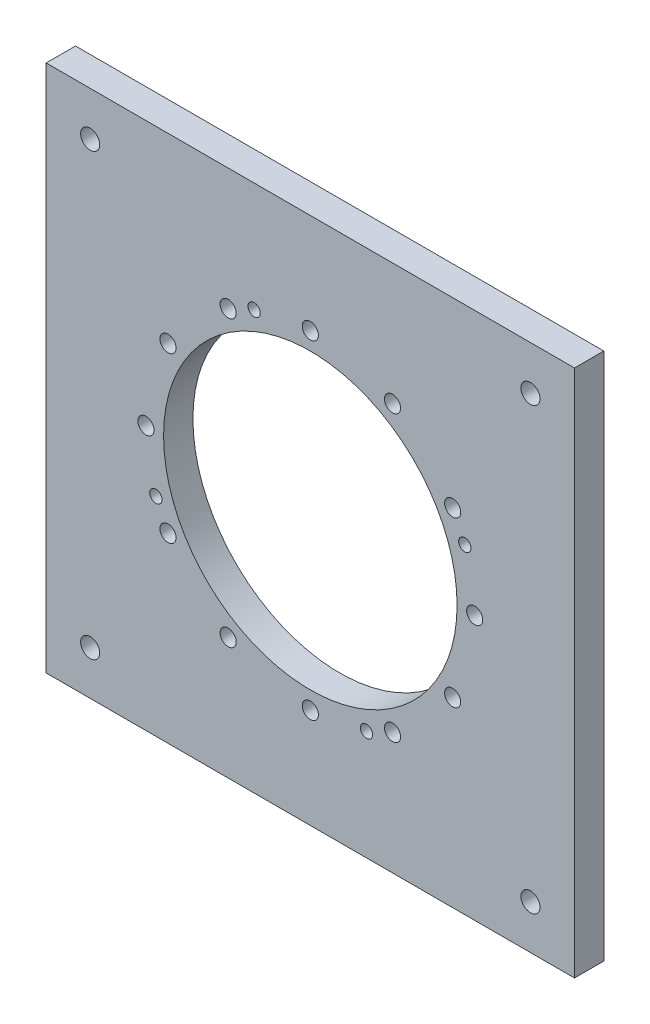
ISO-10303-21;
HEADER;
FILE_DESCRIPTION(('STEP AP214'),'2;1');
FILE_NAME('part.step','',(''),(''),'','','');
FILE_SCHEMA(('AUTOMOTIVE_DESIGN { 1 0 10303 214 1 1 1 1 }'));
ENDSEC;
DATA;
#1=APPLICATION_CONTEXT('core data for automotive mechanical design processes');
#2=APPLICATION_PROTOCOL_DEFINITION('international standard','automotive_design',2000,#1);
#3=PRODUCT_CONTEXT('',#1,'mechanical');
#4=PRODUCT('Part','Part','',(#3));
#5=PRODUCT_RELATED_PRODUCT_CATEGORY('part','',(#4));
#6=PRODUCT_DEFINITION_FORMATION('','',#4);
#7=PRODUCT_DEFINITION_CONTEXT('part definition',#1,'design');
#8=PRODUCT_DEFINITION('design','',#6,#7);
#9=PRODUCT_DEFINITION_SHAPE('','',#8);
#10=(LENGTH_UNIT() NAMED_UNIT(*) SI_UNIT(.MILLI.,.METRE.));
#11=(NAMED_UNIT(*) PLANE_ANGLE_UNIT() SI_UNIT($,.RADIAN.));
#12=(NAMED_UNIT(*) SI_UNIT($,.STERADIAN.) SOLID_ANGLE_UNIT());
#13=UNCERTAINTY_MEASURE_WITH_UNIT(LENGTH_MEASURE(1.E-05),#10,'distance_accuracy_value','');
#14=(GEOMETRIC_REPRESENTATION_CONTEXT(3) GLOBAL_UNCERTAINTY_ASSIGNED_CONTEXT((#13)) GLOBAL_UNIT_ASSIGNED_CONTEXT((#10,
#11,#12)) REPRESENTATION_CONTEXT('',''));
#15=CARTESIAN_POINT('',(0.,0.,0.));
#16=DIRECTION('',(0.,0.,1.));
#17=DIRECTION('',(1.,0.,0.));
#18=AXIS2_PLACEMENT_3D('',#15,#16,#17);
#19=CARTESIAN_POINT('',(-90.,90.,10.));
#20=DIRECTION('',(1.,0.,0.));
#21=DIRECTION('',(0.,0.,-1.));
#22=AXIS2_PLACEMENT_3D('',#19,#20,#21);
#23=PLANE('',#22);
#24=DIRECTION('',(0.,-1.,0.));
#25=VECTOR('',#24,1.);
#26=CARTESIAN_POINT('',(-90.,90.,0.));
#27=LINE('',#26,#25);
#28=CARTESIAN_POINT('',(-90.,90.,0.));
#29=VERTEX_POINT('',#28);
#30=CARTESIAN_POINT('',(-90.,-90.,0.));
#31=VERTEX_POINT('',#30);
#32=EDGE_CURVE('E115',#29,#31,#27,.T.);
#33=ORIENTED_EDGE('',*,*,#32,.T.);
#34=DIRECTION('',(0.,0.,-1.));
#35=VECTOR('',#34,1.);
#36=CARTESIAN_POINT('',(-90.,-90.,10.));
#37=LINE('',#36,#35);
#38=CARTESIAN_POINT('',(-90.,-90.,10.));
#39=VERTEX_POINT('',#38);
#40=EDGE_CURVE('E11',#39,#31,#37,.T.);
#41=ORIENTED_EDGE('',*,*,#40,.F.);
#42=DIRECTION('',(0.,-1.,0.));
#43=VECTOR('',#42,1.);
#44=CARTESIAN_POINT('',(-90.,90.,10.));
#45=LINE('',#44,#43);
#46=CARTESIAN_POINT('',(-90.,90.,10.));
#47=VERTEX_POINT('',#46);
#48=EDGE_CURVE('E99',#47,#39,#45,.T.);
#49=ORIENTED_EDGE('',*,*,#48,.F.);
#50=DIRECTION('',(0.,0.,-1.));
#51=VECTOR('',#50,1.);
#52=CARTESIAN_POINT('',(-90.,90.,10.));
#53=LINE('',#52,#51);
#54=EDGE_CURVE('E111',#47,#29,#53,.T.);
#55=ORIENTED_EDGE('',*,*,#54,.T.);
#56=EDGE_LOOP('',(#33,#41,#49,#55));
#57=FACE_BOUND('',#56,.T.);
#58=ADVANCED_FACE('F47',(#57),#23,.F.);
#59=CARTESIAN_POINT('',(-90.,-90.,10.));
#60=DIRECTION('',(0.,1.,0.));
#61=DIRECTION('',(0.,0.,1.));
#62=AXIS2_PLACEMENT_3D('',#59,#60,#61);
#63=PLANE('',#62);
#64=DIRECTION('',(1.,0.,0.));
#65=VECTOR('',#64,1.);
#66=CARTESIAN_POINT('',(-90.,-90.,0.));
#67=LINE('',#66,#65);
#68=CARTESIAN_POINT('',(90.,-90.,0.));
#69=VERTEX_POINT('',#68);
#70=EDGE_CURVE('E104',#31,#69,#67,.T.);
#71=ORIENTED_EDGE('',*,*,#70,.T.);
#72=DIRECTION('',(0.,0.,-1.));
#73=VECTOR('',#72,1.);
#74=CARTESIAN_POINT('',(90.,-90.,10.));
#75=LINE('',#74,#73);
#76=CARTESIAN_POINT('',(90.,-90.,10.));
#77=VERTEX_POINT('',#76);
#78=EDGE_CURVE('E56',#77,#69,#75,.T.);
#79=ORIENTED_EDGE('',*,*,#78,.F.);
#80=DIRECTION('',(1.,0.,0.));
#81=VECTOR('',#80,1.);
#82=CARTESIAN_POINT('',(-90.,-90.,10.));
#83=LINE('',#82,#81);
#84=EDGE_CURVE('E94',#39,#77,#83,.T.);
#85=ORIENTED_EDGE('',*,*,#84,.F.);
#86=ORIENTED_EDGE('',*,*,#40,.T.);
#87=EDGE_LOOP('',(#71,#79,#85,#86));
#88=FACE_BOUND('',#87,.T.);
#89=ADVANCED_FACE('F103',(#88),#63,.F.);
#90=CARTESIAN_POINT('',(90.,-90.,10.));
#91=DIRECTION('',(-1.,0.,0.));
#92=DIRECTION('',(0.,0.,1.));
#93=AXIS2_PLACEMENT_3D('',#90,#91,#92);
#94=PLANE('',#93);
#95=DIRECTION('',(0.,1.,0.));
#96=VECTOR('',#95,1.);
#97=CARTESIAN_POINT('',(90.,-90.,0.));
#98=LINE('',#97,#96);
#99=CARTESIAN_POINT('',(90.,90.,0.));
#100=VERTEX_POINT('',#99);
#101=EDGE_CURVE('E81',#69,#100,#98,.T.);
#102=ORIENTED_EDGE('',*,*,#101,.T.);
#103=DIRECTION('',(0.,0.,-1.));
#104=VECTOR('',#103,1.);
#105=CARTESIAN_POINT('',(90.,90.,10.));
#106=LINE('',#105,#104);
#107=CARTESIAN_POINT('',(90.,90.,10.));
#108=VERTEX_POINT('',#107);
#109=EDGE_CURVE('E106',#108,#100,#106,.T.);
#110=ORIENTED_EDGE('',*,*,#109,.F.);
#111=DIRECTION('',(0.,1.,0.));
#112=VECTOR('',#111,1.);
#113=CARTESIAN_POINT('',(90.,-90.,10.));
#114=LINE('',#113,#112);
#115=EDGE_CURVE('E97',#77,#108,#114,.T.);
#116=ORIENTED_EDGE('',*,*,#115,.F.);
#117=ORIENTED_EDGE('',*,*,#78,.T.);
#118=EDGE_LOOP('',(#102,#110,#116,#117));
#119=FACE_BOUND('',#118,.T.);
#120=ADVANCED_FACE('F107',(#119),#94,.F.);
#121=CARTESIAN_POINT('',(90.,90.,10.));
#122=DIRECTION('',(0.,-1.,0.));
#123=DIRECTION('',(0.,0.,-1.));
#124=AXIS2_PLACEMENT_3D('',#121,#122,#123);
#125=PLANE('',#124);
#126=DIRECTION('',(-1.,0.,0.));
#127=VECTOR('',#126,1.);
#128=CARTESIAN_POINT('',(90.,90.,0.));
#129=LINE('',#128,#127);
#130=EDGE_CURVE('E87',#100,#29,#129,.T.);
#131=ORIENTED_EDGE('',*,*,#130,.T.);
#132=ORIENTED_EDGE('',*,*,#54,.F.);
#133=DIRECTION('',(-1.,0.,0.));
#134=VECTOR('',#133,1.);
#135=CARTESIAN_POINT('',(90.,90.,10.));
#136=LINE('',#135,#134);
#137=EDGE_CURVE('E64',#108,#47,#136,.T.);
#138=ORIENTED_EDGE('',*,*,#137,.F.);
#139=ORIENTED_EDGE('',*,*,#109,.T.);
#140=EDGE_LOOP('',(#131,#132,#138,#139));
#141=FACE_BOUND('',#140,.T.);
#142=ADVANCED_FACE('F129',(#141),#125,.F.);
#143=CARTESIAN_POINT('',(0.,0.,10.));
#144=DIRECTION('',(0.,0.,1.));
#145=DIRECTION('',(1.,0.,0.));
#146=AXIS2_PLACEMENT_3D('',#143,#144,#145);
#147=PLANE('',#146);
#148=CARTESIAN_POINT('',(-28.,-48.4974226119286,10.));
#149=DIRECTION('',(0.,0.,1.));
#150=DIRECTION('',(1.,0.,0.));
#151=AXIS2_PLACEMENT_3D('',#148,#149,#150);
#152=CIRCLE('',#151,2.75);
#153=CARTESIAN_POINT('',(-25.25,-48.4974226119286,10.));
#154=VERTEX_POINT('',#153);
#155=EDGE_CURVE('E119',#154,#154,#152,.T.);
#156=ORIENTED_EDGE('',*,*,#155,.F.);
#157=EDGE_LOOP('',(#156));
#158=FACE_BOUND('',#157,.T.);
#159=CARTESIAN_POINT('',(0.,-56.,10.));
#160=DIRECTION('',(0.,0.,1.));
#161=DIRECTION('',(1.,0.,0.));
#162=AXIS2_PLACEMENT_3D('',#159,#160,#161);
#163=CIRCLE('',#162,2.75);
#164=CARTESIAN_POINT('',(2.74999999999999,-56.,10.));
#165=VERTEX_POINT('',#164);
#166=EDGE_CURVE('E139',#165,#165,#163,.T.);
#167=ORIENTED_EDGE('',*,*,#166,.F.);
#168=EDGE_LOOP('',(#167));
#169=FACE_BOUND('',#168,.T.);
#170=CARTESIAN_POINT('',(28.,-48.4974226119286,10.));
#171=DIRECTION('',(0.,0.,1.));
#172=DIRECTION('',(1.,0.,0.));
#173=AXIS2_PLACEMENT_3D('',#170,#171,#172);
#174=CIRCLE('',#173,2.75);
#175=CARTESIAN_POINT('',(30.75,-48.4974226119286,10.));
#176=VERTEX_POINT('',#175);
#177=EDGE_CURVE('E143',#176,#176,#174,.T.);
#178=ORIENTED_EDGE('',*,*,#177,.F.);
#179=EDGE_LOOP('',(#178));
#180=FACE_BOUND('',#179,.T.);
#181=CARTESIAN_POINT('',(48.4974226119285,-28.,10.));
#182=DIRECTION('',(0.,0.,1.));
#183=DIRECTION('',(1.,0.,0.));
#184=AXIS2_PLACEMENT_3D('',#181,#182,#183);
#185=CIRCLE('',#184,2.75);
#186=CARTESIAN_POINT('',(51.2474226119285,-28.,10.));
#187=VERTEX_POINT('',#186);
#188=EDGE_CURVE('E147',#187,#187,#185,.T.);
#189=ORIENTED_EDGE('',*,*,#188,.F.);
#190=EDGE_LOOP('',(#189));
#191=FACE_BOUND('',#190,.T.);
#192=CARTESIAN_POINT('',(52.6227867640109,19.1531280262374,10.));
#193=DIRECTION('',(0.,0.,1.));
#194=DIRECTION('',(1.,0.,0.));
#195=AXIS2_PLACEMENT_3D('',#192,#193,#194);
#196=CIRCLE('',#195,2.1);
#197=CARTESIAN_POINT('',(54.7227867640109,19.1531280262374,10.));
#198=VERTEX_POINT('',#197);
#199=EDGE_CURVE('E151',#198,#198,#196,.T.);
#200=ORIENTED_EDGE('',*,*,#199,.F.);
#201=EDGE_LOOP('',(#200));
#202=FACE_BOUND('',#201,.T.);
#203=CARTESIAN_POINT('',(-19.1531280262374,52.6227867640109,10.));
#204=DIRECTION('',(0.,0.,1.));
#205=DIRECTION('',(1.,0.,0.));
#206=AXIS2_PLACEMENT_3D('',#203,#204,#205);
#207=CIRCLE('',#206,2.1);
#208=CARTESIAN_POINT('',(-17.0531280262374,52.6227867640109,10.));
#209=VERTEX_POINT('',#208);
#210=EDGE_CURVE('E155',#209,#209,#207,.T.);
#211=ORIENTED_EDGE('',*,*,#210,.F.);
#212=EDGE_LOOP('',(#211));
#213=FACE_BOUND('',#212,.T.);
#214=CARTESIAN_POINT('',(-52.6227867640109,-19.1531280262374,10.));
#215=DIRECTION('',(0.,0.,1.));
#216=DIRECTION('',(1.,0.,0.));
#217=AXIS2_PLACEMENT_3D('',#214,#215,#216);
#218=CIRCLE('',#217,2.1);
#219=CARTESIAN_POINT('',(-50.5227867640109,-19.1531280262374,10.));
#220=VERTEX_POINT('',#219);
#221=EDGE_CURVE('E159',#220,#220,#218,.T.);
#222=ORIENTED_EDGE('',*,*,#221,.F.);
#223=EDGE_LOOP('',(#222));
#224=FACE_BOUND('',#223,.T.);
#225=CARTESIAN_POINT('',(19.1531280262375,-52.6227867640109,10.));
#226=DIRECTION('',(0.,0.,1.));
#227=DIRECTION('',(1.,0.,0.));
#228=AXIS2_PLACEMENT_3D('',#225,#226,#227);
#229=CIRCLE('',#228,2.1);
#230=CARTESIAN_POINT('',(21.2531280262375,-52.6227867640109,10.));
#231=VERTEX_POINT('',#230);
#232=EDGE_CURVE('E163',#231,#231,#229,.T.);
#233=ORIENTED_EDGE('',*,*,#232,.F.);
#234=EDGE_LOOP('',(#233));
#235=FACE_BOUND('',#234,.T.);
#236=CARTESIAN_POINT('',(-48.4974226119286,-28.,10.));
#237=DIRECTION('',(0.,0.,1.));
#238=DIRECTION('',(1.,0.,0.));
#239=AXIS2_PLACEMENT_3D('',#236,#237,#238);
#240=CIRCLE('',#239,2.75);
#241=CARTESIAN_POINT('',(-45.7474226119286,-28.,10.));
#242=VERTEX_POINT('',#241);
#243=EDGE_CURVE('E167',#242,#242,#240,.T.);
#244=ORIENTED_EDGE('',*,*,#243,.F.);
#245=EDGE_LOOP('',(#244));
#246=FACE_BOUND('',#245,.T.);
#247=CARTESIAN_POINT('',(-56.,0.,10.));
#248=DIRECTION('',(0.,0.,1.));
#249=DIRECTION('',(1.,0.,0.));
#250=AXIS2_PLACEMENT_3D('',#247,#248,#249);
#251=CIRCLE('',#250,2.75);
#252=CARTESIAN_POINT('',(-53.25,0.,10.));
#253=VERTEX_POINT('',#252);
#254=EDGE_CURVE('E171',#253,#253,#251,.T.);
#255=ORIENTED_EDGE('',*,*,#254,.F.);
#256=EDGE_LOOP('',(#255));
#257=FACE_BOUND('',#256,.T.);
#258=CARTESIAN_POINT('',(-48.4974226119286,28.,10.));
#259=DIRECTION('',(0.,0.,1.));
#260=DIRECTION('',(1.,0.,0.));
#261=AXIS2_PLACEMENT_3D('',#258,#259,#260);
#262=CIRCLE('',#261,2.75);
#263=CARTESIAN_POINT('',(-45.7474226119286,28.,10.));
#264=VERTEX_POINT('',#263);
#265=EDGE_CURVE('E175',#264,#264,#262,.T.);
#266=ORIENTED_EDGE('',*,*,#265,.F.);
#267=EDGE_LOOP('',(#266));
#268=FACE_BOUND('',#267,.T.);
#269=CARTESIAN_POINT('',(-28.,48.4974226119286,10.));
#270=DIRECTION('',(0.,0.,1.));
#271=DIRECTION('',(1.,0.,0.));
#272=AXIS2_PLACEMENT_3D('',#269,#270,#271);
#273=CIRCLE('',#272,2.75);
#274=CARTESIAN_POINT('',(-25.25,48.4974226119286,10.));
#275=VERTEX_POINT('',#274);
#276=EDGE_CURVE('E179',#275,#275,#273,.T.);
#277=ORIENTED_EDGE('',*,*,#276,.F.);
#278=EDGE_LOOP('',(#277));
#279=FACE_BOUND('',#278,.T.);
#280=CARTESIAN_POINT('',(0.,56.,10.));
#281=DIRECTION('',(0.,0.,1.));
#282=DIRECTION('',(1.,0.,0.));
#283=AXIS2_PLACEMENT_3D('',#280,#281,#282);
#284=CIRCLE('',#283,2.75);
#285=CARTESIAN_POINT('',(2.75,56.,10.));
#286=VERTEX_POINT('',#285);
#287=EDGE_CURVE('E183',#286,#286,#284,.T.);
#288=ORIENTED_EDGE('',*,*,#287,.F.);
#289=EDGE_LOOP('',(#288));
#290=FACE_BOUND('',#289,.T.);
#291=CARTESIAN_POINT('',(28.,48.4974226119286,10.));
#292=DIRECTION('',(0.,0.,1.));
#293=DIRECTION('',(1.,0.,0.));
#294=AXIS2_PLACEMENT_3D('',#291,#292,#293);
#295=CIRCLE('',#294,2.75);
#296=CARTESIAN_POINT('',(30.75,48.4974226119286,10.));
#297=VERTEX_POINT('',#296);
#298=EDGE_CURVE('E187',#297,#297,#295,.T.);
#299=ORIENTED_EDGE('',*,*,#298,.F.);
#300=EDGE_LOOP('',(#299));
#301=FACE_BOUND('',#300,.T.);
#302=CARTESIAN_POINT('',(48.4974226119286,28.,10.));
#303=DIRECTION('',(0.,0.,1.));
#304=DIRECTION('',(1.,0.,0.));
#305=AXIS2_PLACEMENT_3D('',#302,#303,#304);
#306=CIRCLE('',#305,2.75);
#307=CARTESIAN_POINT('',(51.2474226119286,28.,10.));
#308=VERTEX_POINT('',#307);
#309=EDGE_CURVE('E191',#308,#308,#306,.T.);
#310=ORIENTED_EDGE('',*,*,#309,.F.);
#311=EDGE_LOOP('',(#310));
#312=FACE_BOUND('',#311,.T.);
#313=CARTESIAN_POINT('',(56.,0.,10.));
#314=DIRECTION('',(0.,0.,1.));
#315=DIRECTION('',(1.,0.,0.));
#316=AXIS2_PLACEMENT_3D('',#313,#314,#315);
#317=CIRCLE('',#316,2.75);
#318=CARTESIAN_POINT('',(58.75,0.,10.));
#319=VERTEX_POINT('',#318);
#320=EDGE_CURVE('E195',#319,#319,#317,.T.);
#321=ORIENTED_EDGE('',*,*,#320,.F.);
#322=EDGE_LOOP('',(#321));
#323=FACE_BOUND('',#322,.T.);
#324=CARTESIAN_POINT('',(-75.,-75.,10.));
#325=DIRECTION('',(0.,0.,1.));
#326=DIRECTION('',(1.,0.,0.));
#327=AXIS2_PLACEMENT_3D('',#324,#325,#326);
#328=CIRCLE('',#327,3.25);
#329=CARTESIAN_POINT('',(-71.75,-75.,10.));
#330=VERTEX_POINT('',#329);
#331=EDGE_CURVE('E199',#330,#330,#328,.T.);
#332=ORIENTED_EDGE('',*,*,#331,.F.);
#333=EDGE_LOOP('',(#332));
#334=FACE_BOUND('',#333,.T.);
#335=CARTESIAN_POINT('',(-75.,75.,10.));
#336=DIRECTION('',(0.,0.,1.));
#337=DIRECTION('',(1.,0.,0.));
#338=AXIS2_PLACEMENT_3D('',#335,#336,#337);
#339=CIRCLE('',#338,3.25);
#340=CARTESIAN_POINT('',(-71.75,75.,10.));
#341=VERTEX_POINT('',#340);
#342=EDGE_CURVE('E203',#341,#341,#339,.T.);
#343=ORIENTED_EDGE('',*,*,#342,.F.);
#344=EDGE_LOOP('',(#343));
#345=FACE_BOUND('',#344,.T.);
#346=CARTESIAN_POINT('',(75.,-75.,10.));
#347=DIRECTION('',(0.,0.,1.));
#348=DIRECTION('',(1.,0.,0.));
#349=AXIS2_PLACEMENT_3D('',#346,#347,#348);
#350=CIRCLE('',#349,3.25);
#351=CARTESIAN_POINT('',(78.25,-75.,10.));
#352=VERTEX_POINT('',#351);
#353=EDGE_CURVE('E207',#352,#352,#350,.T.);
#354=ORIENTED_EDGE('',*,*,#353,.F.);
#355=EDGE_LOOP('',(#354));
#356=FACE_BOUND('',#355,.T.);
#357=CARTESIAN_POINT('',(75.,75.,10.));
#358=DIRECTION('',(0.,0.,1.));
#359=DIRECTION('',(1.,0.,0.));
#360=AXIS2_PLACEMENT_3D('',#357,#358,#359);
#361=CIRCLE('',#360,3.25);
#362=CARTESIAN_POINT('',(78.25,75.,10.));
#363=VERTEX_POINT('',#362);
#364=EDGE_CURVE('E211',#363,#363,#361,.T.);
#365=ORIENTED_EDGE('',*,*,#364,.F.);
#366=EDGE_LOOP('',(#365));
#367=FACE_BOUND('',#366,.T.);
#368=CARTESIAN_POINT('',(0.,0.,10.));
#369=DIRECTION('',(0.,0.,1.));
#370=DIRECTION('',(1.,0.,0.));
#371=AXIS2_PLACEMENT_3D('',#368,#369,#370);
#372=CIRCLE('',#371,50.);
#373=CARTESIAN_POINT('',(50.,0.,10.));
#374=VERTEX_POINT('',#373);
#375=EDGE_CURVE('E215',#374,#374,#372,.T.);
#376=ORIENTED_EDGE('',*,*,#375,.F.);
#377=EDGE_LOOP('',(#376));
#378=FACE_BOUND('',#377,.T.);
#379=ORIENTED_EDGE('',*,*,#48,.T.);
#380=ORIENTED_EDGE('',*,*,#84,.T.);
#381=ORIENTED_EDGE('',*,*,#115,.T.);
#382=ORIENTED_EDGE('',*,*,#137,.T.);
#383=EDGE_LOOP('',(#379,#380,#381,#382));
#384=FACE_BOUND('',#383,.T.);
#385=ADVANCED_FACE('F95',(#158,#169,#180,#191,#202,#213,#224,#235,#246,#257,#268,#279,#290,#301,
#312,#323,#334,#345,#356,#367,#378,#384),#147,.T.);
#386=CARTESIAN_POINT('',(0.,0.,0.));
#387=DIRECTION('',(0.,0.,1.));
#388=DIRECTION('',(1.,0.,0.));
#389=AXIS2_PLACEMENT_3D('',#386,#387,#388);
#390=PLANE('',#389);
#391=CARTESIAN_POINT('',(-28.,-48.4974226119286,0.));
#392=DIRECTION('',(0.,0.,-1.));
#393=DIRECTION('',(-1.,0.,0.));
#394=AXIS2_PLACEMENT_3D('',#391,#392,#393);
#395=CIRCLE('',#394,2.75);
#396=CARTESIAN_POINT('',(-30.75,-48.4974226119286,0.));
#397=VERTEX_POINT('',#396);
#398=EDGE_CURVE('E229',#397,#397,#395,.T.);
#399=ORIENTED_EDGE('',*,*,#398,.F.);
#400=EDGE_LOOP('',(#399));
#401=FACE_BOUND('',#400,.T.);
#402=CARTESIAN_POINT('',(0.,-56.,0.));
#403=DIRECTION('',(0.,0.,-1.));
#404=DIRECTION('',(-1.,0.,0.));
#405=AXIS2_PLACEMENT_3D('',#402,#403,#404);
#406=CIRCLE('',#405,2.75);
#407=CARTESIAN_POINT('',(-2.75000000000001,-56.,0.));
#408=VERTEX_POINT('',#407);
#409=EDGE_CURVE('E265',#408,#408,#406,.T.);
#410=ORIENTED_EDGE('',*,*,#409,.F.);
#411=EDGE_LOOP('',(#410));
#412=FACE_BOUND('',#411,.T.);
#413=CARTESIAN_POINT('',(28.,-48.4974226119286,0.));
#414=DIRECTION('',(0.,0.,-1.));
#415=DIRECTION('',(-1.,0.,0.));
#416=AXIS2_PLACEMENT_3D('',#413,#414,#415);
#417=CIRCLE('',#416,2.75);
#418=CARTESIAN_POINT('',(25.25,-48.4974226119286,0.));
#419=VERTEX_POINT('',#418);
#420=EDGE_CURVE('E260',#419,#419,#417,.T.);
#421=ORIENTED_EDGE('',*,*,#420,.F.);
#422=EDGE_LOOP('',(#421));
#423=FACE_BOUND('',#422,.T.);
#424=CARTESIAN_POINT('',(48.4974226119285,-28.,0.));
#425=DIRECTION('',(0.,0.,-1.));
#426=DIRECTION('',(-1.,0.,0.));
#427=AXIS2_PLACEMENT_3D('',#424,#425,#426);
#428=CIRCLE('',#427,2.75);
#429=CARTESIAN_POINT('',(45.7474226119285,-28.,0.));
#430=VERTEX_POINT('',#429);
#431=EDGE_CURVE('E256',#430,#430,#428,.T.);
#432=ORIENTED_EDGE('',*,*,#431,.F.);
#433=EDGE_LOOP('',(#432));
#434=FACE_BOUND('',#433,.T.);
#435=CARTESIAN_POINT('',(52.6227867640109,19.1531280262374,0.));
#436=DIRECTION('',(0.,0.,-1.));
#437=DIRECTION('',(-1.,0.,0.));
#438=AXIS2_PLACEMENT_3D('',#435,#436,#437);
#439=CIRCLE('',#438,2.1);
#440=CARTESIAN_POINT('',(50.5227867640109,19.1531280262374,0.));
#441=VERTEX_POINT('',#440);
#442=EDGE_CURVE('E261',#441,#441,#439,.T.);
#443=ORIENTED_EDGE('',*,*,#442,.F.);
#444=EDGE_LOOP('',(#443));
#445=FACE_BOUND('',#444,.T.);
#446=CARTESIAN_POINT('',(-19.1531280262374,52.6227867640109,0.));
#447=DIRECTION('',(0.,0.,-1.));
#448=DIRECTION('',(-1.,0.,0.));
#449=AXIS2_PLACEMENT_3D('',#446,#447,#448);
#450=CIRCLE('',#449,2.1);
#451=CARTESIAN_POINT('',(-21.2531280262374,52.6227867640109,0.));
#452=VERTEX_POINT('',#451);
#453=EDGE_CURVE('E281',#452,#452,#450,.T.);
#454=ORIENTED_EDGE('',*,*,#453,.F.);
#455=EDGE_LOOP('',(#454));
#456=FACE_BOUND('',#455,.T.);
#457=CARTESIAN_POINT('',(-52.6227867640109,-19.1531280262374,0.));
#458=DIRECTION('',(0.,0.,-1.));
#459=DIRECTION('',(-1.,0.,0.));
#460=AXIS2_PLACEMENT_3D('',#457,#458,#459);
#461=CIRCLE('',#460,2.1);
#462=CARTESIAN_POINT('',(-54.7227867640109,-19.1531280262374,0.));
#463=VERTEX_POINT('',#462);
#464=EDGE_CURVE('E276',#463,#463,#461,.T.);
#465=ORIENTED_EDGE('',*,*,#464,.F.);
#466=EDGE_LOOP('',(#465));
#467=FACE_BOUND('',#466,.T.);
#468=CARTESIAN_POINT('',(19.1531280262375,-52.6227867640109,0.));
#469=DIRECTION('',(0.,0.,-1.));
#470=DIRECTION('',(-1.,0.,0.));
#471=AXIS2_PLACEMENT_3D('',#468,#469,#470);
#472=CIRCLE('',#471,2.1);
#473=CARTESIAN_POINT('',(17.0531280262375,-52.6227867640109,0.));
#474=VERTEX_POINT('',#473);
#475=EDGE_CURVE('E272',#474,#474,#472,.T.);
#476=ORIENTED_EDGE('',*,*,#475,.F.);
#477=EDGE_LOOP('',(#476));
#478=FACE_BOUND('',#477,.T.);
#479=CARTESIAN_POINT('',(-48.4974226119286,-28.,0.));
#480=DIRECTION('',(0.,0.,-1.));
#481=DIRECTION('',(-1.,0.,0.));
#482=AXIS2_PLACEMENT_3D('',#479,#480,#481);
#483=CIRCLE('',#482,2.75);
#484=CARTESIAN_POINT('',(-51.2474226119286,-28.,0.));
#485=VERTEX_POINT('',#484);
#486=EDGE_CURVE('E224',#485,#485,#483,.T.);
#487=ORIENTED_EDGE('',*,*,#486,.F.);
#488=EDGE_LOOP('',(#487));
#489=FACE_BOUND('',#488,.T.);
#490=CARTESIAN_POINT('',(-56.,0.,0.));
#491=DIRECTION('',(0.,0.,-1.));
#492=DIRECTION('',(-1.,0.,0.));
#493=AXIS2_PLACEMENT_3D('',#490,#491,#492);
#494=CIRCLE('',#493,2.75);
#495=CARTESIAN_POINT('',(-58.75,0.,0.));
#496=VERTEX_POINT('',#495);
#497=EDGE_CURVE('E228',#496,#496,#494,.T.);
#498=ORIENTED_EDGE('',*,*,#497,.F.);
#499=EDGE_LOOP('',(#498));
#500=FACE_BOUND('',#499,.T.);
#501=CARTESIAN_POINT('',(-48.4974226119286,28.,0.));
#502=DIRECTION('',(0.,0.,-1.));
#503=DIRECTION('',(-1.,0.,0.));
#504=AXIS2_PLACEMENT_3D('',#501,#502,#503);
#505=CIRCLE('',#504,2.75);
#506=CARTESIAN_POINT('',(-51.2474226119286,28.,0.));
#507=VERTEX_POINT('',#506);
#508=EDGE_CURVE('E233',#507,#507,#505,.T.);
#509=ORIENTED_EDGE('',*,*,#508,.F.);
#510=EDGE_LOOP('',(#509));
#511=FACE_BOUND('',#510,.T.);
#512=CARTESIAN_POINT('',(-28.,48.4974226119286,0.));
#513=DIRECTION('',(0.,0.,-1.));
#514=DIRECTION('',(-1.,0.,0.));
#515=AXIS2_PLACEMENT_3D('',#512,#513,#514);
#516=CIRCLE('',#515,2.75);
#517=CARTESIAN_POINT('',(-30.75,48.4974226119286,0.));
#518=VERTEX_POINT('',#517);
#519=EDGE_CURVE('E237',#518,#518,#516,.T.);
#520=ORIENTED_EDGE('',*,*,#519,.F.);
#521=EDGE_LOOP('',(#520));
#522=FACE_BOUND('',#521,.T.);
#523=CARTESIAN_POINT('',(0.,56.,0.));
#524=DIRECTION('',(0.,0.,-1.));
#525=DIRECTION('',(-1.,0.,0.));
#526=AXIS2_PLACEMENT_3D('',#523,#524,#525);
#527=CIRCLE('',#526,2.75);
#528=CARTESIAN_POINT('',(-2.75,56.,0.));
#529=VERTEX_POINT('',#528);
#530=EDGE_CURVE('E241',#529,#529,#527,.T.);
#531=ORIENTED_EDGE('',*,*,#530,.F.);
#532=EDGE_LOOP('',(#531));
#533=FACE_BOUND('',#532,.T.);
#534=CARTESIAN_POINT('',(28.,48.4974226119286,0.));
#535=DIRECTION('',(0.,0.,-1.));
#536=DIRECTION('',(-1.,0.,0.));
#537=AXIS2_PLACEMENT_3D('',#534,#535,#536);
#538=CIRCLE('',#537,2.75);
#539=CARTESIAN_POINT('',(25.25,48.4974226119286,0.));
#540=VERTEX_POINT('',#539);
#541=EDGE_CURVE('E245',#540,#540,#538,.T.);
#542=ORIENTED_EDGE('',*,*,#541,.F.);
#543=EDGE_LOOP('',(#542));
#544=FACE_BOUND('',#543,.T.);
#545=CARTESIAN_POINT('',(48.4974226119286,28.,0.));
#546=DIRECTION('',(0.,0.,-1.));
#547=DIRECTION('',(-1.,0.,0.));
#548=AXIS2_PLACEMENT_3D('',#545,#546,#547);
#549=CIRCLE('',#548,2.75);
#550=CARTESIAN_POINT('',(45.7474226119286,28.,0.));
#551=VERTEX_POINT('',#550);
#552=EDGE_CURVE('E249',#551,#551,#549,.T.);
#553=ORIENTED_EDGE('',*,*,#552,.F.);
#554=EDGE_LOOP('',(#553));
#555=FACE_BOUND('',#554,.T.);
#556=CARTESIAN_POINT('',(56.,0.,0.));
#557=DIRECTION('',(0.,0.,-1.));
#558=DIRECTION('',(-1.,0.,0.));
#559=AXIS2_PLACEMENT_3D('',#556,#557,#558);
#560=CIRCLE('',#559,2.75);
#561=CARTESIAN_POINT('',(53.25,0.,0.));
#562=VERTEX_POINT('',#561);
#563=EDGE_CURVE('E223',#562,#562,#560,.T.);
#564=ORIENTED_EDGE('',*,*,#563,.F.);
#565=EDGE_LOOP('',(#564));
#566=FACE_BOUND('',#565,.T.);
#567=CARTESIAN_POINT('',(-75.,-75.,0.));
#568=DIRECTION('',(0.,0.,-1.));
#569=DIRECTION('',(-1.,0.,0.));
#570=AXIS2_PLACEMENT_3D('',#567,#568,#569);
#571=CIRCLE('',#570,3.25);
#572=CARTESIAN_POINT('',(-78.25,-75.,0.));
#573=VERTEX_POINT('',#572);
#574=EDGE_CURVE('E277',#573,#573,#571,.T.);
#575=ORIENTED_EDGE('',*,*,#574,.F.);
#576=EDGE_LOOP('',(#575));
#577=FACE_BOUND('',#576,.T.);
#578=CARTESIAN_POINT('',(-75.,75.,0.));
#579=DIRECTION('',(0.,0.,-1.));
#580=DIRECTION('',(-1.,0.,0.));
#581=AXIS2_PLACEMENT_3D('',#578,#579,#580);
#582=CIRCLE('',#581,3.25);
#583=CARTESIAN_POINT('',(-78.25,75.,0.));
#584=VERTEX_POINT('',#583);
#585=EDGE_CURVE('E296',#584,#584,#582,.T.);
#586=ORIENTED_EDGE('',*,*,#585,.F.);
#587=EDGE_LOOP('',(#586));
#588=FACE_BOUND('',#587,.T.);
#589=CARTESIAN_POINT('',(75.,-75.,0.));
#590=DIRECTION('',(0.,0.,-1.));
#591=DIRECTION('',(-1.,0.,0.));
#592=AXIS2_PLACEMENT_3D('',#589,#590,#591);
#593=CIRCLE('',#592,3.25);
#594=CARTESIAN_POINT('',(71.75,-75.,0.));
#595=VERTEX_POINT('',#594);
#596=EDGE_CURVE('E292',#595,#595,#593,.T.);
#597=ORIENTED_EDGE('',*,*,#596,.F.);
#598=EDGE_LOOP('',(#597));
#599=FACE_BOUND('',#598,.T.);
#600=CARTESIAN_POINT('',(75.,75.,0.));
#601=DIRECTION('',(0.,0.,-1.));
#602=DIRECTION('',(-1.,0.,0.));
#603=AXIS2_PLACEMENT_3D('',#600,#601,#602);
#604=CIRCLE('',#603,3.25);
#605=CARTESIAN_POINT('',(71.75,75.,0.));
#606=VERTEX_POINT('',#605);
#607=EDGE_CURVE('E288',#606,#606,#604,.T.);
#608=ORIENTED_EDGE('',*,*,#607,.F.);
#609=EDGE_LOOP('',(#608));
#610=FACE_BOUND('',#609,.T.);
#611=CARTESIAN_POINT('',(0.,0.,0.));
#612=DIRECTION('',(0.,0.,-1.));
#613=DIRECTION('',(-1.,0.,0.));
#614=AXIS2_PLACEMENT_3D('',#611,#612,#613);
#615=CIRCLE('',#614,50.);
#616=CARTESIAN_POINT('',(-50.,0.,0.));
#617=VERTEX_POINT('',#616);
#618=EDGE_CURVE('E219',#617,#617,#615,.T.);
#619=ORIENTED_EDGE('',*,*,#618,.F.);
#620=EDGE_LOOP('',(#619));
#621=FACE_BOUND('',#620,.T.);
#622=ORIENTED_EDGE('',*,*,#32,.F.);
#623=ORIENTED_EDGE('',*,*,#130,.F.);
#624=ORIENTED_EDGE('',*,*,#101,.F.);
#625=ORIENTED_EDGE('',*,*,#70,.F.);
#626=EDGE_LOOP('',(#622,#623,#624,#625));
#627=FACE_BOUND('',#626,.T.);
#628=ADVANCED_FACE('F132',(#401,#412,#423,#434,#445,#456,#467,#478,#489,#500,#511,#522,#533,
#544,#555,#566,#577,#588,#599,#610,#621,#627),#390,.F.);
#629=CARTESIAN_POINT('',(0.,0.,11.));
#630=DIRECTION('',(0.,0.,-1.));
#631=DIRECTION('',(-1.,0.,0.));
#632=AXIS2_PLACEMENT_3D('',#629,#630,#631);
#633=CYLINDRICAL_SURFACE('',#632,50.);
#634=ORIENTED_EDGE('',*,*,#375,.T.);
#635=EDGE_LOOP('',(#634));
#636=FACE_BOUND('',#635,.T.);
#637=ORIENTED_EDGE('',*,*,#618,.T.);
#638=EDGE_LOOP('',(#637));
#639=FACE_BOUND('',#638,.T.);
#640=ADVANCED_FACE('F308',(#636,#639),#633,.F.);
#641=CARTESIAN_POINT('',(75.,75.,11.));
#642=DIRECTION('',(0.,0.,-1.));
#643=DIRECTION('',(-1.,0.,0.));
#644=AXIS2_PLACEMENT_3D('',#641,#642,#643);
#645=CYLINDRICAL_SURFACE('',#644,3.25);
#646=ORIENTED_EDGE('',*,*,#364,.T.);
#647=EDGE_LOOP('',(#646));
#648=FACE_BOUND('',#647,.T.);
#649=ORIENTED_EDGE('',*,*,#607,.T.);
#650=EDGE_LOOP('',(#649));
#651=FACE_BOUND('',#650,.T.);
#652=ADVANCED_FACE('F320',(#648,#651),#645,.F.);
#653=CARTESIAN_POINT('',(75.,-75.,11.));
#654=DIRECTION('',(0.,0.,-1.));
#655=DIRECTION('',(-1.,0.,0.));
#656=AXIS2_PLACEMENT_3D('',#653,#654,#655);
#657=CYLINDRICAL_SURFACE('',#656,3.25);
#658=ORIENTED_EDGE('',*,*,#353,.T.);
#659=EDGE_LOOP('',(#658));
#660=FACE_BOUND('',#659,.T.);
#661=ORIENTED_EDGE('',*,*,#596,.T.);
#662=EDGE_LOOP('',(#661));
#663=FACE_BOUND('',#662,.T.);
#664=ADVANCED_FACE('F326',(#660,#663),#657,.F.);
#665=CARTESIAN_POINT('',(-75.,75.,11.));
#666=DIRECTION('',(0.,0.,-1.));
#667=DIRECTION('',(-1.,0.,0.));
#668=AXIS2_PLACEMENT_3D('',#665,#666,#667);
#669=CYLINDRICAL_SURFACE('',#668,3.25);
#670=ORIENTED_EDGE('',*,*,#342,.T.);
#671=EDGE_LOOP('',(#670));
#672=FACE_BOUND('',#671,.T.);
#673=ORIENTED_EDGE('',*,*,#585,.T.);
#674=EDGE_LOOP('',(#673));
#675=FACE_BOUND('',#674,.T.);
#676=ADVANCED_FACE('F390',(#672,#675),#669,.F.);
#677=CARTESIAN_POINT('',(-75.,-75.,11.));
#678=DIRECTION('',(0.,0.,-1.));
#679=DIRECTION('',(-1.,0.,0.));
#680=AXIS2_PLACEMENT_3D('',#677,#678,#679);
#681=CYLINDRICAL_SURFACE('',#680,3.25);
#682=ORIENTED_EDGE('',*,*,#331,.T.);
#683=EDGE_LOOP('',(#682));
#684=FACE_BOUND('',#683,.T.);
#685=ORIENTED_EDGE('',*,*,#574,.T.);
#686=EDGE_LOOP('',(#685));
#687=FACE_BOUND('',#686,.T.);
#688=ADVANCED_FACE('F304',(#684,#687),#681,.F.);
#689=CARTESIAN_POINT('',(56.,0.,11.));
#690=DIRECTION('',(0.,0.,-1.));
#691=DIRECTION('',(-1.,0.,0.));
#692=AXIS2_PLACEMENT_3D('',#689,#690,#691);
#693=CYLINDRICAL_SURFACE('',#692,2.75);
#694=ORIENTED_EDGE('',*,*,#320,.T.);
#695=EDGE_LOOP('',(#694));
#696=FACE_BOUND('',#695,.T.);
#697=ORIENTED_EDGE('',*,*,#563,.T.);
#698=EDGE_LOOP('',(#697));
#699=FACE_BOUND('',#698,.T.);
#700=ADVANCED_FACE('F432',(#696,#699),#693,.F.);
#701=CARTESIAN_POINT('',(48.4974226119286,28.,11.));
#702=DIRECTION('',(0.,0.,-1.));
#703=DIRECTION('',(-1.,0.,0.));
#704=AXIS2_PLACEMENT_3D('',#701,#702,#703);
#705=CYLINDRICAL_SURFACE('',#704,2.75);
#706=ORIENTED_EDGE('',*,*,#309,.T.);
#707=EDGE_LOOP('',(#706));
#708=FACE_BOUND('',#707,.T.);
#709=ORIENTED_EDGE('',*,*,#552,.T.);
#710=EDGE_LOOP('',(#709));
#711=FACE_BOUND('',#710,.T.);
#712=ADVANCED_FACE('F435',(#708,#711),#705,.F.);
#713=CARTESIAN_POINT('',(28.,48.4974226119286,11.));
#714=DIRECTION('',(0.,0.,-1.));
#715=DIRECTION('',(-1.,0.,0.));
#716=AXIS2_PLACEMENT_3D('',#713,#714,#715);
#717=CYLINDRICAL_SURFACE('',#716,2.75);
#718=ORIENTED_EDGE('',*,*,#298,.T.);
#719=EDGE_LOOP('',(#718));
#720=FACE_BOUND('',#719,.T.);
#721=ORIENTED_EDGE('',*,*,#541,.T.);
#722=EDGE_LOOP('',(#721));
#723=FACE_BOUND('',#722,.T.);
#724=ADVANCED_FACE('F439',(#720,#723),#717,.F.);
#725=CARTESIAN_POINT('',(0.,56.,11.));
#726=DIRECTION('',(0.,0.,-1.));
#727=DIRECTION('',(-1.,0.,0.));
#728=AXIS2_PLACEMENT_3D('',#725,#726,#727);
#729=CYLINDRICAL_SURFACE('',#728,2.75);
#730=ORIENTED_EDGE('',*,*,#287,.T.);
#731=EDGE_LOOP('',(#730));
#732=FACE_BOUND('',#731,.T.);
#733=ORIENTED_EDGE('',*,*,#530,.T.);
#734=EDGE_LOOP('',(#733));
#735=FACE_BOUND('',#734,.T.);
#736=ADVANCED_FACE('F443',(#732,#735),#729,.F.);
#737=CARTESIAN_POINT('',(-28.,48.4974226119286,11.));
#738=DIRECTION('',(0.,0.,-1.));
#739=DIRECTION('',(-1.,0.,0.));
#740=AXIS2_PLACEMENT_3D('',#737,#738,#739);
#741=CYLINDRICAL_SURFACE('',#740,2.75);
#742=ORIENTED_EDGE('',*,*,#276,.T.);
#743=EDGE_LOOP('',(#742));
#744=FACE_BOUND('',#743,.T.);
#745=ORIENTED_EDGE('',*,*,#519,.T.);
#746=EDGE_LOOP('',(#745));
#747=FACE_BOUND('',#746,.T.);
#748=ADVANCED_FACE('F447',(#744,#747),#741,.F.);
#749=CARTESIAN_POINT('',(-48.4974226119286,28.,11.));
#750=DIRECTION('',(0.,0.,-1.));
#751=DIRECTION('',(-1.,0.,0.));
#752=AXIS2_PLACEMENT_3D('',#749,#750,#751);
#753=CYLINDRICAL_SURFACE('',#752,2.75);
#754=ORIENTED_EDGE('',*,*,#265,.T.);
#755=EDGE_LOOP('',(#754));
#756=FACE_BOUND('',#755,.T.);
#757=ORIENTED_EDGE('',*,*,#508,.T.);
#758=EDGE_LOOP('',(#757));
#759=FACE_BOUND('',#758,.T.);
#760=ADVANCED_FACE('F451',(#756,#759),#753,.F.);
#761=CARTESIAN_POINT('',(-56.,0.,11.));
#762=DIRECTION('',(0.,0.,-1.));
#763=DIRECTION('',(-1.,0.,0.));
#764=AXIS2_PLACEMENT_3D('',#761,#762,#763);
#765=CYLINDRICAL_SURFACE('',#764,2.75);
#766=ORIENTED_EDGE('',*,*,#254,.T.);
#767=EDGE_LOOP('',(#766));
#768=FACE_BOUND('',#767,.T.);
#769=ORIENTED_EDGE('',*,*,#497,.T.);
#770=EDGE_LOOP('',(#769));
#771=FACE_BOUND('',#770,.T.);
#772=ADVANCED_FACE('F455',(#768,#771),#765,.F.);
#773=CARTESIAN_POINT('',(-48.4974226119286,-28.,11.));
#774=DIRECTION('',(0.,0.,-1.));
#775=DIRECTION('',(-1.,0.,0.));
#776=AXIS2_PLACEMENT_3D('',#773,#774,#775);
#777=CYLINDRICAL_SURFACE('',#776,2.75);
#778=ORIENTED_EDGE('',*,*,#243,.T.);
#779=EDGE_LOOP('',(#778));
#780=FACE_BOUND('',#779,.T.);
#781=ORIENTED_EDGE('',*,*,#486,.T.);
#782=EDGE_LOOP('',(#781));
#783=FACE_BOUND('',#782,.T.);
#784=ADVANCED_FACE('F415',(#780,#783),#777,.F.);
#785=CARTESIAN_POINT('',(19.1531280262375,-52.6227867640109,11.));
#786=DIRECTION('',(0.,0.,-1.));
#787=DIRECTION('',(-1.,0.,0.));
#788=AXIS2_PLACEMENT_3D('',#785,#786,#787);
#789=CYLINDRICAL_SURFACE('',#788,2.1);
#790=ORIENTED_EDGE('',*,*,#232,.T.);
#791=EDGE_LOOP('',(#790));
#792=FACE_BOUND('',#791,.T.);
#793=ORIENTED_EDGE('',*,*,#475,.T.);
#794=EDGE_LOOP('',(#793));
#795=FACE_BOUND('',#794,.T.);
#796=ADVANCED_FACE('F411',(#792,#795),#789,.F.);
#797=CARTESIAN_POINT('',(-52.6227867640109,-19.1531280262374,11.));
#798=DIRECTION('',(0.,0.,-1.));
#799=DIRECTION('',(-1.,0.,0.));
#800=AXIS2_PLACEMENT_3D('',#797,#798,#799);
#801=CYLINDRICAL_SURFACE('',#800,2.1);
#802=ORIENTED_EDGE('',*,*,#221,.T.);
#803=EDGE_LOOP('',(#802));
#804=FACE_BOUND('',#803,.T.);
#805=ORIENTED_EDGE('',*,*,#464,.T.);
#806=EDGE_LOOP('',(#805));
#807=FACE_BOUND('',#806,.T.);
#808=ADVANCED_FACE('F407',(#804,#807),#801,.F.);
#809=CARTESIAN_POINT('',(-19.1531280262374,52.6227867640109,11.));
#810=DIRECTION('',(0.,0.,-1.));
#811=DIRECTION('',(-1.,0.,0.));
#812=AXIS2_PLACEMENT_3D('',#809,#810,#811);
#813=CYLINDRICAL_SURFACE('',#812,2.1);
#814=ORIENTED_EDGE('',*,*,#210,.T.);
#815=EDGE_LOOP('',(#814));
#816=FACE_BOUND('',#815,.T.);
#817=ORIENTED_EDGE('',*,*,#453,.T.);
#818=EDGE_LOOP('',(#817));
#819=FACE_BOUND('',#818,.T.);
#820=ADVANCED_FACE('F403',(#816,#819),#813,.F.);
#821=CARTESIAN_POINT('',(52.6227867640109,19.1531280262374,11.));
#822=DIRECTION('',(0.,0.,-1.));
#823=DIRECTION('',(-1.,0.,0.));
#824=AXIS2_PLACEMENT_3D('',#821,#822,#823);
#825=CYLINDRICAL_SURFACE('',#824,2.1);
#826=ORIENTED_EDGE('',*,*,#199,.T.);
#827=EDGE_LOOP('',(#826));
#828=FACE_BOUND('',#827,.T.);
#829=ORIENTED_EDGE('',*,*,#442,.T.);
#830=EDGE_LOOP('',(#829));
#831=FACE_BOUND('',#830,.T.);
#832=ADVANCED_FACE('F399',(#828,#831),#825,.F.);
#833=CARTESIAN_POINT('',(48.4974226119285,-28.,11.));
#834=DIRECTION('',(0.,0.,-1.));
#835=DIRECTION('',(-1.,0.,0.));
#836=AXIS2_PLACEMENT_3D('',#833,#834,#835);
#837=CYLINDRICAL_SURFACE('',#836,2.75);
#838=ORIENTED_EDGE('',*,*,#188,.T.);
#839=EDGE_LOOP('',(#838));
#840=FACE_BOUND('',#839,.T.);
#841=ORIENTED_EDGE('',*,*,#431,.T.);
#842=EDGE_LOOP('',(#841));
#843=FACE_BOUND('',#842,.T.);
#844=ADVANCED_FACE('F402',(#840,#843),#837,.F.);
#845=CARTESIAN_POINT('',(28.,-48.4974226119286,11.));
#846=DIRECTION('',(0.,0.,-1.));
#847=DIRECTION('',(-1.,0.,0.));
#848=AXIS2_PLACEMENT_3D('',#845,#846,#847);
#849=CYLINDRICAL_SURFACE('',#848,2.75);
#850=ORIENTED_EDGE('',*,*,#177,.T.);
#851=EDGE_LOOP('',(#850));
#852=FACE_BOUND('',#851,.T.);
#853=ORIENTED_EDGE('',*,*,#420,.T.);
#854=EDGE_LOOP('',(#853));
#855=FACE_BOUND('',#854,.T.);
#856=ADVANCED_FACE('F424',(#852,#855),#849,.F.);
#857=CARTESIAN_POINT('',(0.,-56.,11.));
#858=DIRECTION('',(0.,0.,-1.));
#859=DIRECTION('',(-1.,0.,0.));
#860=AXIS2_PLACEMENT_3D('',#857,#858,#859);
#861=CYLINDRICAL_SURFACE('',#860,2.75);
#862=ORIENTED_EDGE('',*,*,#166,.T.);
#863=EDGE_LOOP('',(#862));
#864=FACE_BOUND('',#863,.T.);
#865=ORIENTED_EDGE('',*,*,#409,.T.);
#866=EDGE_LOOP('',(#865));
#867=FACE_BOUND('',#866,.T.);
#868=ADVANCED_FACE('F420',(#864,#867),#861,.F.);
#869=CARTESIAN_POINT('',(-28.,-48.4974226119286,11.));
#870=DIRECTION('',(0.,0.,-1.));
#871=DIRECTION('',(-1.,0.,0.));
#872=AXIS2_PLACEMENT_3D('',#869,#870,#871);
#873=CYLINDRICAL_SURFACE('',#872,2.75);
#874=ORIENTED_EDGE('',*,*,#155,.T.);
#875=EDGE_LOOP('',(#874));
#876=FACE_BOUND('',#875,.T.);
#877=ORIENTED_EDGE('',*,*,#398,.T.);
#878=EDGE_LOOP('',(#877));
#879=FACE_BOUND('',#878,.T.);
#880=ADVANCED_FACE('F417',(#876,#879),#873,.F.);
#881=CLOSED_SHELL('',(#58,#89,#120,#142,#385,#628,#640,#652,#664,#676,#688,#700,#712,#724,#736,
#748,#760,#772,#784,#796,#808,#820,#832,#844,#856,#868,#880));
#882=MANIFOLD_SOLID_BREP('B2',#881);
#883=ADVANCED_BREP_SHAPE_REPRESENTATION('',(#18,#882),#14);
#884=SHAPE_DEFINITION_REPRESENTATION(#9,#883);
ENDSEC;
END-ISO-10303-21;
